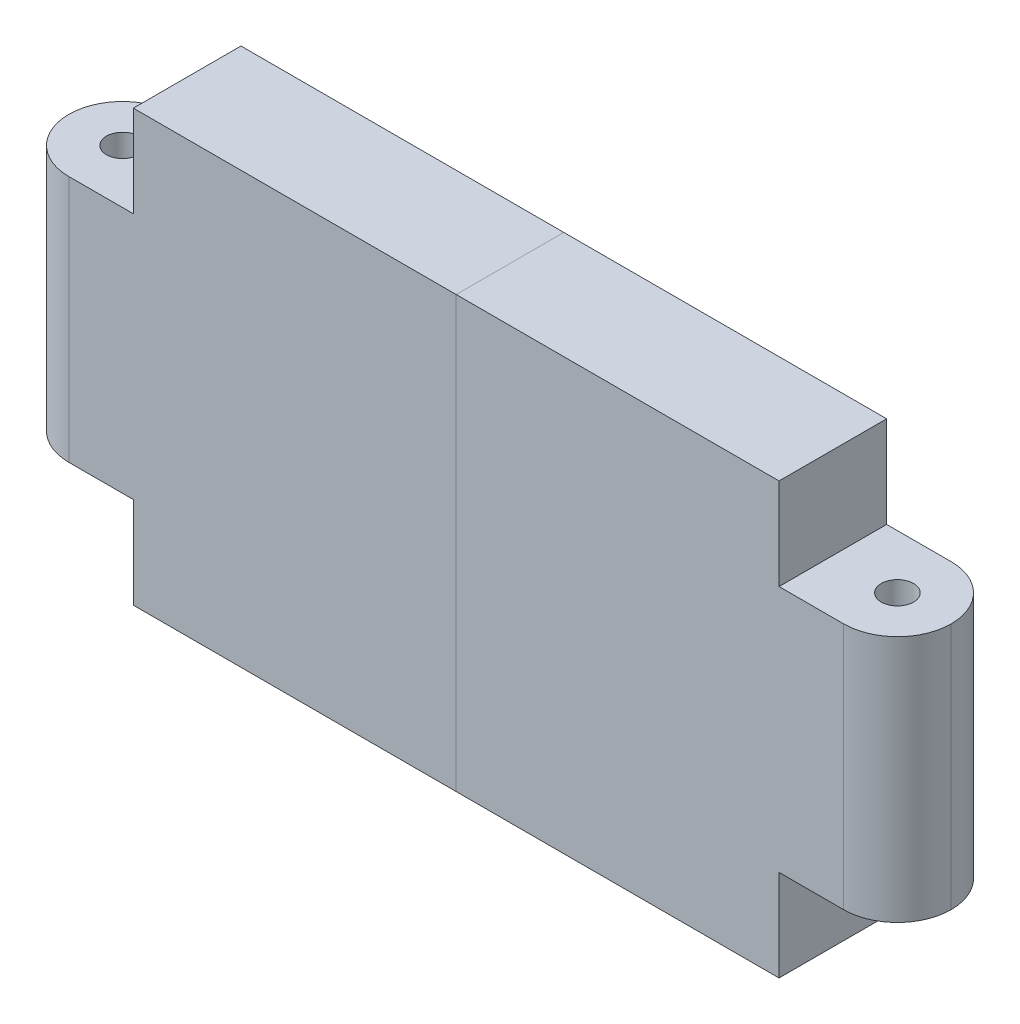
ISO-10303-21;
HEADER;
FILE_DESCRIPTION(('STEP AP214'),'2;1');
FILE_NAME('part.step','',(''),(''),'','','');
FILE_SCHEMA(('AUTOMOTIVE_DESIGN { 1 0 10303 214 1 1 1 1 }'));
ENDSEC;
DATA;
#1=APPLICATION_CONTEXT('core data for automotive mechanical design processes');
#2=APPLICATION_PROTOCOL_DEFINITION('international standard','automotive_design',2000,#1);
#3=PRODUCT_CONTEXT('',#1,'mechanical');
#4=PRODUCT('Part','Part','',(#3));
#5=PRODUCT_RELATED_PRODUCT_CATEGORY('part','',(#4));
#6=PRODUCT_DEFINITION_FORMATION('','',#4);
#7=PRODUCT_DEFINITION_CONTEXT('part definition',#1,'design');
#8=PRODUCT_DEFINITION('design','',#6,#7);
#9=PRODUCT_DEFINITION_SHAPE('','',#8);
#10=(LENGTH_UNIT() NAMED_UNIT(*) SI_UNIT(.MILLI.,.METRE.));
#11=(NAMED_UNIT(*) PLANE_ANGLE_UNIT() SI_UNIT($,.RADIAN.));
#12=(NAMED_UNIT(*) SI_UNIT($,.STERADIAN.) SOLID_ANGLE_UNIT());
#13=UNCERTAINTY_MEASURE_WITH_UNIT(LENGTH_MEASURE(1.E-05),#10,'distance_accuracy_value','');
#14=(GEOMETRIC_REPRESENTATION_CONTEXT(3) GLOBAL_UNCERTAINTY_ASSIGNED_CONTEXT((#13)) GLOBAL_UNIT_ASSIGNED_CONTEXT((#10,
#11,#12)) REPRESENTATION_CONTEXT('',''));
#15=CARTESIAN_POINT('',(0.,0.,0.));
#16=DIRECTION('',(0.,0.,1.));
#17=DIRECTION('',(1.,0.,0.));
#18=AXIS2_PLACEMENT_3D('',#15,#16,#17);
#19=CARTESIAN_POINT('',(0.,0.,0.));
#20=DIRECTION('',(-1.,0.,0.));
#21=DIRECTION('',(0.,-1.,0.));
#22=AXIS2_PLACEMENT_3D('',#19,#20,#21);
#23=PLANE('',#22);
#24=DIRECTION('',(0.,-1.,0.));
#25=VECTOR('',#24,1.);
#26=CARTESIAN_POINT('',(0.,0.,10.));
#27=LINE('',#26,#25);
#28=CARTESIAN_POINT('',(0.,20.,10.));
#29=VERTEX_POINT('',#28);
#30=CARTESIAN_POINT('',(0.,-20.,10.));
#31=VERTEX_POINT('',#30);
#32=EDGE_CURVE('E174',#29,#31,#27,.T.);
#33=ORIENTED_EDGE('',*,*,#32,.F.);
#34=DIRECTION('',(0.,0.,-1.));
#35=VECTOR('',#34,1.);
#36=CARTESIAN_POINT('',(0.,20.,10.));
#37=LINE('',#36,#35);
#38=CARTESIAN_POINT('',(0.,20.,0.));
#39=VERTEX_POINT('',#38);
#40=EDGE_CURVE('E140',#29,#39,#37,.T.);
#41=ORIENTED_EDGE('',*,*,#40,.T.);
#42=DIRECTION('',(0.,-1.,0.));
#43=VECTOR('',#42,1.);
#44=CARTESIAN_POINT('',(0.,0.,0.));
#45=LINE('',#44,#43);
#46=CARTESIAN_POINT('',(0.,-20.,0.));
#47=VERTEX_POINT('',#46);
#48=EDGE_CURVE('E127',#39,#47,#45,.T.);
#49=ORIENTED_EDGE('',*,*,#48,.T.);
#50=DIRECTION('',(0.,0.,1.));
#51=VECTOR('',#50,1.);
#52=CARTESIAN_POINT('',(0.,-20.,10.));
#53=LINE('',#52,#51);
#54=EDGE_CURVE('E136',#47,#31,#53,.T.);
#55=ORIENTED_EDGE('',*,*,#54,.T.);
#56=EDGE_LOOP('',(#33,#41,#49,#55));
#57=FACE_BOUND('',#56,.T.);
#58=ADVANCED_FACE('F48',(#57),#23,.T.);
#59=CARTESIAN_POINT('',(-30.,20.,10.));
#60=DIRECTION('',(0.,-1.,0.));
#61=DIRECTION('',(0.,0.,-1.));
#62=AXIS2_PLACEMENT_3D('',#59,#60,#61);
#63=PLANE('',#62);
#64=ORIENTED_EDGE('',*,*,#40,.F.);
#65=DIRECTION('',(-1.,0.,0.));
#66=VECTOR('',#65,1.);
#67=CARTESIAN_POINT('',(-30.,20.,10.));
#68=LINE('',#67,#66);
#69=CARTESIAN_POINT('',(30.,20.,10.));
#70=VERTEX_POINT('',#69);
#71=EDGE_CURVE('E148',#70,#29,#68,.T.);
#72=ORIENTED_EDGE('',*,*,#71,.F.);
#73=DIRECTION('',(0.,0.,-1.));
#74=VECTOR('',#73,1.);
#75=CARTESIAN_POINT('',(30.,20.,10.));
#76=LINE('',#75,#74);
#77=CARTESIAN_POINT('',(30.,20.,0.));
#78=VERTEX_POINT('',#77);
#79=EDGE_CURVE('E190',#70,#78,#76,.T.);
#80=ORIENTED_EDGE('',*,*,#79,.T.);
#81=DIRECTION('',(-1.,0.,0.));
#82=VECTOR('',#81,1.);
#83=CARTESIAN_POINT('',(-30.,20.,0.));
#84=LINE('',#83,#82);
#85=EDGE_CURVE('E52',#78,#39,#84,.T.);
#86=ORIENTED_EDGE('',*,*,#85,.T.);
#87=EDGE_LOOP('',(#64,#72,#80,#86));
#88=FACE_BOUND('',#87,.T.);
#89=ADVANCED_FACE('F214',(#88),#63,.F.);
#90=CARTESIAN_POINT('',(-30.,-20.,10.));
#91=DIRECTION('',(0.,1.,0.));
#92=DIRECTION('',(0.,0.,1.));
#93=AXIS2_PLACEMENT_3D('',#90,#91,#92);
#94=PLANE('',#93);
#95=ORIENTED_EDGE('',*,*,#54,.F.);
#96=DIRECTION('',(1.,0.,0.));
#97=VECTOR('',#96,1.);
#98=CARTESIAN_POINT('',(-30.,-20.,0.));
#99=LINE('',#98,#97);
#100=CARTESIAN_POINT('',(30.,-20.,0.));
#101=VERTEX_POINT('',#100);
#102=EDGE_CURVE('E122',#47,#101,#99,.T.);
#103=ORIENTED_EDGE('',*,*,#102,.T.);
#104=DIRECTION('',(0.,0.,-1.));
#105=VECTOR('',#104,1.);
#106=CARTESIAN_POINT('',(30.,-20.,10.));
#107=LINE('',#106,#105);
#108=CARTESIAN_POINT('',(30.,-20.,10.));
#109=VERTEX_POINT('',#108);
#110=EDGE_CURVE('E149',#109,#101,#107,.T.);
#111=ORIENTED_EDGE('',*,*,#110,.F.);
#112=DIRECTION('',(1.,0.,0.));
#113=VECTOR('',#112,1.);
#114=CARTESIAN_POINT('',(-30.,-20.,10.));
#115=LINE('',#114,#113);
#116=EDGE_CURVE('E138',#31,#109,#115,.T.);
#117=ORIENTED_EDGE('',*,*,#116,.F.);
#118=EDGE_LOOP('',(#95,#103,#111,#117));
#119=FACE_BOUND('',#118,.T.);
#120=ADVANCED_FACE('F137',(#119),#94,.F.);
#121=CARTESIAN_POINT('',(0.,0.,10.));
#122=DIRECTION('',(0.,0.,1.));
#123=DIRECTION('',(1.,0.,0.));
#124=AXIS2_PLACEMENT_3D('',#121,#122,#123);
#125=PLANE('',#124);
#126=ORIENTED_EDGE('',*,*,#71,.T.);
#127=ORIENTED_EDGE('',*,*,#32,.T.);
#128=ORIENTED_EDGE('',*,*,#116,.T.);
#129=DIRECTION('',(0.,1.,0.));
#130=VECTOR('',#129,1.);
#131=CARTESIAN_POINT('',(30.,20.,10.));
#132=LINE('',#131,#130);
#133=CARTESIAN_POINT('',(30.,-11.5,10.));
#134=VERTEX_POINT('',#133);
#135=EDGE_CURVE('E151',#109,#134,#132,.T.);
#136=ORIENTED_EDGE('',*,*,#135,.T.);
#137=DIRECTION('',(-1.,0.,0.));
#138=VECTOR('',#137,1.);
#139=CARTESIAN_POINT('',(41.,-11.5,10.));
#140=LINE('',#139,#138);
#141=CARTESIAN_POINT('',(36.,-11.5,10.));
#142=VERTEX_POINT('',#141);
#143=EDGE_CURVE('E73',#142,#134,#140,.T.);
#144=ORIENTED_EDGE('',*,*,#143,.F.);
#145=DIRECTION('',(0.,1.,0.));
#146=VECTOR('',#145,1.);
#147=CARTESIAN_POINT('',(36.,0.,10.));
#148=LINE('',#147,#146);
#149=CARTESIAN_POINT('',(36.,11.5,10.));
#150=VERTEX_POINT('',#149);
#151=EDGE_CURVE('E175',#142,#150,#148,.T.);
#152=ORIENTED_EDGE('',*,*,#151,.T.);
#153=DIRECTION('',(-1.,0.,0.));
#154=VECTOR('',#153,1.);
#155=CARTESIAN_POINT('',(41.,11.5,10.));
#156=LINE('',#155,#154);
#157=CARTESIAN_POINT('',(30.,11.5,10.));
#158=VERTEX_POINT('',#157);
#159=EDGE_CURVE('E65',#150,#158,#156,.T.);
#160=ORIENTED_EDGE('',*,*,#159,.T.);
#161=EDGE_CURVE('E133',#158,#70,#132,.T.);
#162=ORIENTED_EDGE('',*,*,#161,.T.);
#163=EDGE_LOOP('',(#126,#127,#128,#136,#144,#152,#160,#162));
#164=FACE_BOUND('',#163,.T.);
#165=ADVANCED_FACE('F50',(#164),#125,.T.);
#166=CARTESIAN_POINT('',(0.,0.,0.));
#167=DIRECTION('',(0.,0.,1.));
#168=DIRECTION('',(1.,0.,0.));
#169=AXIS2_PLACEMENT_3D('',#166,#167,#168);
#170=PLANE('',#169);
#171=ORIENTED_EDGE('',*,*,#48,.F.);
#172=ORIENTED_EDGE('',*,*,#85,.F.);
#173=DIRECTION('',(0.,1.,0.));
#174=VECTOR('',#173,1.);
#175=CARTESIAN_POINT('',(30.,20.,0.));
#176=LINE('',#175,#174);
#177=CARTESIAN_POINT('',(30.,11.5,0.));
#178=VERTEX_POINT('',#177);
#179=EDGE_CURVE('E161',#178,#78,#176,.T.);
#180=ORIENTED_EDGE('',*,*,#179,.F.);
#181=DIRECTION('',(-1.,0.,0.));
#182=VECTOR('',#181,1.);
#183=CARTESIAN_POINT('',(41.,11.5,0.));
#184=LINE('',#183,#182);
#185=CARTESIAN_POINT('',(36.,11.5,0.));
#186=VERTEX_POINT('',#185);
#187=EDGE_CURVE('E159',#186,#178,#184,.T.);
#188=ORIENTED_EDGE('',*,*,#187,.F.);
#189=DIRECTION('',(0.,-1.,0.));
#190=VECTOR('',#189,1.);
#191=CARTESIAN_POINT('',(36.,-11.5,0.));
#192=LINE('',#191,#190);
#193=CARTESIAN_POINT('',(36.,-11.5,0.));
#194=VERTEX_POINT('',#193);
#195=EDGE_CURVE('E187',#186,#194,#192,.T.);
#196=ORIENTED_EDGE('',*,*,#195,.T.);
#197=DIRECTION('',(-1.,0.,0.));
#198=VECTOR('',#197,1.);
#199=CARTESIAN_POINT('',(41.,-11.5,0.));
#200=LINE('',#199,#198);
#201=CARTESIAN_POINT('',(30.,-11.5,0.));
#202=VERTEX_POINT('',#201);
#203=EDGE_CURVE('E164',#194,#202,#200,.T.);
#204=ORIENTED_EDGE('',*,*,#203,.T.);
#205=EDGE_CURVE('E129',#101,#202,#176,.T.);
#206=ORIENTED_EDGE('',*,*,#205,.F.);
#207=ORIENTED_EDGE('',*,*,#102,.F.);
#208=EDGE_LOOP('',(#171,#172,#180,#188,#196,#204,#206,#207));
#209=FACE_BOUND('',#208,.T.);
#210=ADVANCED_FACE('F124',(#209),#170,.F.);
#211=CARTESIAN_POINT('',(30.,20.,10.));
#212=DIRECTION('',(-1.,0.,0.));
#213=DIRECTION('',(0.,-1.,0.));
#214=AXIS2_PLACEMENT_3D('',#211,#212,#213);
#215=PLANE('',#214);
#216=ORIENTED_EDGE('',*,*,#205,.T.);
#217=DIRECTION('',(0.,0.,1.));
#218=VECTOR('',#217,1.);
#219=CARTESIAN_POINT('',(30.,-11.5,0.));
#220=LINE('',#219,#218);
#221=EDGE_CURVE('E166',#202,#134,#220,.T.);
#222=ORIENTED_EDGE('',*,*,#221,.T.);
#223=ORIENTED_EDGE('',*,*,#135,.F.);
#224=ORIENTED_EDGE('',*,*,#110,.T.);
#225=EDGE_LOOP('',(#216,#222,#223,#224));
#226=FACE_BOUND('',#225,.T.);
#227=ADVANCED_FACE('F195',(#226),#215,.F.);
#228=ORIENTED_EDGE('',*,*,#161,.F.);
#229=DIRECTION('',(0.,0.,-1.));
#230=VECTOR('',#229,1.);
#231=CARTESIAN_POINT('',(30.,11.5,0.));
#232=LINE('',#231,#230);
#233=EDGE_CURVE('E168',#158,#178,#232,.T.);
#234=ORIENTED_EDGE('',*,*,#233,.T.);
#235=ORIENTED_EDGE('',*,*,#179,.T.);
#236=ORIENTED_EDGE('',*,*,#79,.F.);
#237=EDGE_LOOP('',(#228,#234,#235,#236));
#238=FACE_BOUND('',#237,.T.);
#239=ADVANCED_FACE('F234',(#238),#215,.F.);
#240=CARTESIAN_POINT('',(41.,11.5,0.));
#241=DIRECTION('',(0.,1.,0.));
#242=DIRECTION('',(-1.,0.,0.));
#243=AXIS2_PLACEMENT_3D('',#240,#241,#242);
#244=PLANE('',#243);
#245=CARTESIAN_POINT('',(36.,11.5,5.));
#246=DIRECTION('',(0.,-1.,0.));
#247=DIRECTION('',(1.,0.,0.));
#248=AXIS2_PLACEMENT_3D('',#245,#246,#247);
#249=CIRCLE('',#248,1.5);
#250=CARTESIAN_POINT('',(37.5,11.5,5.));
#251=VERTEX_POINT('',#250);
#252=EDGE_CURVE('E57',#251,#251,#249,.T.);
#253=ORIENTED_EDGE('',*,*,#252,.T.);
#254=EDGE_LOOP('',(#253));
#255=FACE_BOUND('',#254,.T.);
#256=CARTESIAN_POINT('',(36.,11.5,5.));
#257=DIRECTION('',(0.,1.,0.));
#258=DIRECTION('',(-1.,0.,0.));
#259=AXIS2_PLACEMENT_3D('',#256,#257,#258);
#260=CIRCLE('',#259,5.);
#261=CARTESIAN_POINT('',(41.,11.5,5.));
#262=VERTEX_POINT('',#261);
#263=EDGE_CURVE('E179',#150,#262,#260,.T.);
#264=ORIENTED_EDGE('',*,*,#263,.T.);
#265=CARTESIAN_POINT('',(36.,11.5,5.));
#266=DIRECTION('',(0.,1.,0.));
#267=DIRECTION('',(-1.,0.,0.));
#268=AXIS2_PLACEMENT_3D('',#265,#266,#267);
#269=CIRCLE('',#268,5.);
#270=EDGE_CURVE('E176',#262,#186,#269,.T.);
#271=ORIENTED_EDGE('',*,*,#270,.T.);
#272=ORIENTED_EDGE('',*,*,#187,.T.);
#273=ORIENTED_EDGE('',*,*,#233,.F.);
#274=ORIENTED_EDGE('',*,*,#159,.F.);
#275=EDGE_LOOP('',(#264,#271,#272,#273,#274));
#276=FACE_BOUND('',#275,.T.);
#277=ADVANCED_FACE('F230',(#255,#276),#244,.T.);
#278=CARTESIAN_POINT('',(41.,-11.5,0.));
#279=DIRECTION('',(0.,-1.,0.));
#280=DIRECTION('',(1.,0.,0.));
#281=AXIS2_PLACEMENT_3D('',#278,#279,#280);
#282=PLANE('',#281);
#283=CARTESIAN_POINT('',(36.,-11.5,5.));
#284=DIRECTION('',(0.,-1.,0.));
#285=DIRECTION('',(1.,0.,0.));
#286=AXIS2_PLACEMENT_3D('',#283,#284,#285);
#287=CIRCLE('',#286,1.5);
#288=CARTESIAN_POINT('',(37.5,-11.5,5.));
#289=VERTEX_POINT('',#288);
#290=EDGE_CURVE('E171',#289,#289,#287,.F.);
#291=ORIENTED_EDGE('',*,*,#290,.T.);
#292=EDGE_LOOP('',(#291));
#293=FACE_BOUND('',#292,.T.);
#294=ORIENTED_EDGE('',*,*,#203,.F.);
#295=CARTESIAN_POINT('',(36.,-11.5,5.));
#296=DIRECTION('',(0.,-1.,0.));
#297=DIRECTION('',(1.,0.,0.));
#298=AXIS2_PLACEMENT_3D('',#295,#296,#297);
#299=CIRCLE('',#298,5.);
#300=CARTESIAN_POINT('',(41.,-11.5,5.));
#301=VERTEX_POINT('',#300);
#302=EDGE_CURVE('E183',#194,#301,#299,.T.);
#303=ORIENTED_EDGE('',*,*,#302,.T.);
#304=CARTESIAN_POINT('',(36.,-11.5,5.));
#305=DIRECTION('',(0.,-1.,0.));
#306=DIRECTION('',(1.,0.,0.));
#307=AXIS2_PLACEMENT_3D('',#304,#305,#306);
#308=CIRCLE('',#307,5.);
#309=EDGE_CURVE('E185',#301,#142,#308,.T.);
#310=ORIENTED_EDGE('',*,*,#309,.T.);
#311=ORIENTED_EDGE('',*,*,#143,.T.);
#312=ORIENTED_EDGE('',*,*,#221,.F.);
#313=EDGE_LOOP('',(#294,#303,#310,#311,#312));
#314=FACE_BOUND('',#313,.T.);
#315=ADVANCED_FACE('F197',(#293,#314),#282,.T.);
#316=CARTESIAN_POINT('',(36.,-18.5,5.));
#317=DIRECTION('',(0.,1.,0.));
#318=DIRECTION('',(-1.,0.,0.));
#319=AXIS2_PLACEMENT_3D('',#316,#317,#318);
#320=CYLINDRICAL_SURFACE('',#319,1.5);
#321=ORIENTED_EDGE('',*,*,#290,.F.);
#322=EDGE_LOOP('',(#321));
#323=FACE_BOUND('',#322,.T.);
#324=ORIENTED_EDGE('',*,*,#252,.F.);
#325=EDGE_LOOP('',(#324));
#326=FACE_BOUND('',#325,.T.);
#327=ADVANCED_FACE('F224',(#323,#326),#320,.F.);
#328=CARTESIAN_POINT('',(36.,0.,5.));
#329=DIRECTION('',(0.,1.,0.));
#330=DIRECTION('',(-1.,0.,0.));
#331=AXIS2_PLACEMENT_3D('',#328,#329,#330);
#332=CYLINDRICAL_SURFACE('',#331,5.);
#333=DIRECTION('',(0.,1.,0.));
#334=VECTOR('',#333,1.);
#335=CARTESIAN_POINT('',(41.,0.,5.));
#336=LINE('',#335,#334);
#337=EDGE_CURVE('E12',#262,#301,#336,.F.);
#338=ORIENTED_EDGE('',*,*,#337,.F.);
#339=ORIENTED_EDGE('',*,*,#263,.F.);
#340=ORIENTED_EDGE('',*,*,#151,.F.);
#341=ORIENTED_EDGE('',*,*,#309,.F.);
#342=EDGE_LOOP('',(#338,#339,#340,#341));
#343=FACE_BOUND('',#342,.T.);
#344=ADVANCED_FACE('F208',(#343),#332,.T.);
#345=CARTESIAN_POINT('',(36.,0.,5.));
#346=DIRECTION('',(0.,1.,0.));
#347=DIRECTION('',(-1.,0.,0.));
#348=AXIS2_PLACEMENT_3D('',#345,#346,#347);
#349=CYLINDRICAL_SURFACE('',#348,5.);
#350=ORIENTED_EDGE('',*,*,#270,.F.);
#351=ORIENTED_EDGE('',*,*,#337,.T.);
#352=ORIENTED_EDGE('',*,*,#302,.F.);
#353=ORIENTED_EDGE('',*,*,#195,.F.);
#354=EDGE_LOOP('',(#350,#351,#352,#353));
#355=FACE_BOUND('',#354,.T.);
#356=ADVANCED_FACE('F204',(#355),#349,.T.);
#357=CLOSED_SHELL('',(#58,#89,#120,#165,#210,#227,#239,#277,#315,#327,#344,#356));
#358=MANIFOLD_SOLID_BREP('B2',#357);
#359=CARTESIAN_POINT('',(0.,0.,0.));
#360=DIRECTION('',(-1.,0.,0.));
#361=DIRECTION('',(0.,-1.,0.));
#362=AXIS2_PLACEMENT_3D('',#359,#360,#361);
#363=PLANE('',#362);
#364=DIRECTION('',(0.,-1.,0.));
#365=VECTOR('',#364,1.);
#366=CARTESIAN_POINT('',(0.,0.,10.));
#367=LINE('',#366,#365);
#368=CARTESIAN_POINT('',(0.,20.,10.));
#369=VERTEX_POINT('',#368);
#370=CARTESIAN_POINT('',(0.,-20.,10.));
#371=VERTEX_POINT('',#370);
#372=EDGE_CURVE('E46',#369,#371,#367,.T.);
#373=ORIENTED_EDGE('',*,*,#372,.T.);
#374=DIRECTION('',(0.,0.,1.));
#375=VECTOR('',#374,1.);
#376=CARTESIAN_POINT('',(0.,-20.,10.));
#377=LINE('',#376,#375);
#378=CARTESIAN_POINT('',(0.,-20.,0.));
#379=VERTEX_POINT('',#378);
#380=EDGE_CURVE('E373',#379,#371,#377,.T.);
#381=ORIENTED_EDGE('',*,*,#380,.F.);
#382=DIRECTION('',(0.,-1.,0.));
#383=VECTOR('',#382,1.);
#384=CARTESIAN_POINT('',(0.,0.,0.));
#385=LINE('',#384,#383);
#386=CARTESIAN_POINT('',(0.,20.,0.));
#387=VERTEX_POINT('',#386);
#388=EDGE_CURVE('E491',#387,#379,#385,.T.);
#389=ORIENTED_EDGE('',*,*,#388,.F.);
#390=DIRECTION('',(0.,0.,-1.));
#391=VECTOR('',#390,1.);
#392=CARTESIAN_POINT('',(0.,20.,10.));
#393=LINE('',#392,#391);
#394=EDGE_CURVE('E360',#369,#387,#393,.T.);
#395=ORIENTED_EDGE('',*,*,#394,.F.);
#396=EDGE_LOOP('',(#373,#381,#389,#395));
#397=FACE_BOUND('',#396,.T.);
#398=ADVANCED_FACE('F353',(#397),#363,.F.);
#399=CARTESIAN_POINT('',(-36.,-18.5,5.));
#400=DIRECTION('',(0.,1.,0.));
#401=DIRECTION('',(-1.,0.,0.));
#402=AXIS2_PLACEMENT_3D('',#399,#400,#401);
#403=CYLINDRICAL_SURFACE('',#402,1.5);
#404=CARTESIAN_POINT('',(-36.,11.5,5.));
#405=DIRECTION('',(0.,1.,0.));
#406=DIRECTION('',(-1.,0.,0.));
#407=AXIS2_PLACEMENT_3D('',#404,#405,#406);
#408=CIRCLE('',#407,1.5);
#409=CARTESIAN_POINT('',(-37.5,11.5,5.));
#410=VERTEX_POINT('',#409);
#411=EDGE_CURVE('E456',#410,#410,#408,.T.);
#412=ORIENTED_EDGE('',*,*,#411,.T.);
#413=EDGE_LOOP('',(#412));
#414=FACE_BOUND('',#413,.T.);
#415=CARTESIAN_POINT('',(-36.,-11.5,5.));
#416=DIRECTION('',(0.,1.,0.));
#417=DIRECTION('',(-1.,0.,0.));
#418=AXIS2_PLACEMENT_3D('',#415,#416,#417);
#419=CIRCLE('',#418,1.5);
#420=CARTESIAN_POINT('',(-37.5,-11.5,5.));
#421=VERTEX_POINT('',#420);
#422=EDGE_CURVE('E450',#421,#421,#419,.T.);
#423=ORIENTED_EDGE('',*,*,#422,.F.);
#424=EDGE_LOOP('',(#423));
#425=FACE_BOUND('',#424,.T.);
#426=ADVANCED_FACE('F532',(#414,#425),#403,.F.);
#427=CARTESIAN_POINT('',(-36.,0.,5.));
#428=DIRECTION('',(0.,1.,0.));
#429=DIRECTION('',(-1.,0.,0.));
#430=AXIS2_PLACEMENT_3D('',#427,#428,#429);
#431=CYLINDRICAL_SURFACE('',#430,5.);
#432=DIRECTION('',(0.,1.,0.));
#433=VECTOR('',#432,1.);
#434=CARTESIAN_POINT('',(-36.,0.,10.));
#435=LINE('',#434,#433);
#436=CARTESIAN_POINT('',(-36.,11.5,10.));
#437=VERTEX_POINT('',#436);
#438=CARTESIAN_POINT('',(-36.,-11.5,10.));
#439=VERTEX_POINT('',#438);
#440=EDGE_CURVE('E430',#437,#439,#435,.F.);
#441=ORIENTED_EDGE('',*,*,#440,.F.);
#442=CARTESIAN_POINT('',(-36.,11.5,5.));
#443=DIRECTION('',(0.,-1.,0.));
#444=DIRECTION('',(1.,0.,0.));
#445=AXIS2_PLACEMENT_3D('',#442,#443,#444);
#446=CIRCLE('',#445,5.);
#447=CARTESIAN_POINT('',(-41.,11.5,5.));
#448=VERTEX_POINT('',#447);
#449=EDGE_CURVE('E487',#448,#437,#446,.F.);
#450=ORIENTED_EDGE('',*,*,#449,.F.);
#451=DIRECTION('',(0.,1.,0.));
#452=VECTOR('',#451,1.);
#453=CARTESIAN_POINT('',(-41.,0.,5.));
#454=LINE('',#453,#452);
#455=CARTESIAN_POINT('',(-41.,-11.5,5.));
#456=VERTEX_POINT('',#455);
#457=EDGE_CURVE('E492',#456,#448,#454,.T.);
#458=ORIENTED_EDGE('',*,*,#457,.F.);
#459=CARTESIAN_POINT('',(-36.,-11.5,5.));
#460=DIRECTION('',(0.,1.,0.));
#461=DIRECTION('',(-1.,0.,0.));
#462=AXIS2_PLACEMENT_3D('',#459,#460,#461);
#463=CIRCLE('',#462,5.);
#464=EDGE_CURVE('E483',#439,#456,#463,.F.);
#465=ORIENTED_EDGE('',*,*,#464,.F.);
#466=EDGE_LOOP('',(#441,#450,#458,#465));
#467=FACE_BOUND('',#466,.T.);
#468=ADVANCED_FACE('F514',(#467),#431,.T.);
#469=CARTESIAN_POINT('',(-30.,20.,10.));
#470=DIRECTION('',(1.,0.,0.));
#471=DIRECTION('',(0.,1.,0.));
#472=AXIS2_PLACEMENT_3D('',#469,#470,#471);
#473=PLANE('',#472);
#474=DIRECTION('',(0.,0.,-1.));
#475=VECTOR('',#474,1.);
#476=CARTESIAN_POINT('',(-30.,11.5,0.));
#477=LINE('',#476,#475);
#478=CARTESIAN_POINT('',(-30.,11.5,10.));
#479=VERTEX_POINT('',#478);
#480=CARTESIAN_POINT('',(-30.,11.5,0.));
#481=VERTEX_POINT('',#480);
#482=EDGE_CURVE('E449',#479,#481,#477,.T.);
#483=ORIENTED_EDGE('',*,*,#482,.F.);
#484=DIRECTION('',(0.,-1.,0.));
#485=VECTOR('',#484,1.);
#486=CARTESIAN_POINT('',(-30.,20.,10.));
#487=LINE('',#486,#485);
#488=CARTESIAN_POINT('',(-30.,20.,10.));
#489=VERTEX_POINT('',#488);
#490=EDGE_CURVE('E444',#489,#479,#487,.T.);
#491=ORIENTED_EDGE('',*,*,#490,.F.);
#492=DIRECTION('',(0.,0.,-1.));
#493=VECTOR('',#492,1.);
#494=CARTESIAN_POINT('',(-30.,20.,10.));
#495=LINE('',#494,#493);
#496=CARTESIAN_POINT('',(-30.,20.,0.));
#497=VERTEX_POINT('',#496);
#498=EDGE_CURVE('E476',#489,#497,#495,.T.);
#499=ORIENTED_EDGE('',*,*,#498,.T.);
#500=DIRECTION('',(0.,-1.,0.));
#501=VECTOR('',#500,1.);
#502=CARTESIAN_POINT('',(-30.,20.,0.));
#503=LINE('',#502,#501);
#504=EDGE_CURVE('E471',#497,#481,#503,.T.);
#505=ORIENTED_EDGE('',*,*,#504,.T.);
#506=EDGE_LOOP('',(#483,#491,#499,#505));
#507=FACE_BOUND('',#506,.T.);
#508=ADVANCED_FACE('F508',(#507),#473,.F.);
#509=CARTESIAN_POINT('',(-41.,11.5,0.));
#510=DIRECTION('',(0.,-1.,0.));
#511=DIRECTION('',(1.,0.,0.));
#512=AXIS2_PLACEMENT_3D('',#509,#510,#511);
#513=PLANE('',#512);
#514=ORIENTED_EDGE('',*,*,#411,.F.);
#515=EDGE_LOOP('',(#514));
#516=FACE_BOUND('',#515,.T.);
#517=DIRECTION('',(1.,0.,0.));
#518=VECTOR('',#517,1.);
#519=CARTESIAN_POINT('',(-41.,11.5,0.));
#520=LINE('',#519,#518);
#521=CARTESIAN_POINT('',(-36.,11.5,0.));
#522=VERTEX_POINT('',#521);
#523=EDGE_CURVE('E453',#522,#481,#520,.T.);
#524=ORIENTED_EDGE('',*,*,#523,.F.);
#525=CARTESIAN_POINT('',(-36.,11.5,5.));
#526=DIRECTION('',(0.,-1.,0.));
#527=DIRECTION('',(1.,0.,0.));
#528=AXIS2_PLACEMENT_3D('',#525,#526,#527);
#529=CIRCLE('',#528,5.);
#530=EDGE_CURVE('E489',#522,#448,#529,.F.);
#531=ORIENTED_EDGE('',*,*,#530,.T.);
#532=ORIENTED_EDGE('',*,*,#449,.T.);
#533=DIRECTION('',(1.,0.,0.));
#534=VECTOR('',#533,1.);
#535=CARTESIAN_POINT('',(-41.,11.5,10.));
#536=LINE('',#535,#534);
#537=EDGE_CURVE('E435',#437,#479,#536,.T.);
#538=ORIENTED_EDGE('',*,*,#537,.T.);
#539=ORIENTED_EDGE('',*,*,#482,.T.);
#540=EDGE_LOOP('',(#524,#531,#532,#538,#539));
#541=FACE_BOUND('',#540,.T.);
#542=ADVANCED_FACE('F511',(#516,#541),#513,.F.);
#543=CARTESIAN_POINT('',(-36.,0.,5.));
#544=DIRECTION('',(0.,1.,0.));
#545=DIRECTION('',(-1.,0.,0.));
#546=AXIS2_PLACEMENT_3D('',#543,#544,#545);
#547=CYLINDRICAL_SURFACE('',#546,5.);
#548=ORIENTED_EDGE('',*,*,#530,.F.);
#549=DIRECTION('',(0.,-1.,0.));
#550=VECTOR('',#549,1.);
#551=CARTESIAN_POINT('',(-36.,11.5,0.));
#552=LINE('',#551,#550);
#553=CARTESIAN_POINT('',(-36.,-11.5,0.));
#554=VERTEX_POINT('',#553);
#555=EDGE_CURVE('E479',#554,#522,#552,.F.);
#556=ORIENTED_EDGE('',*,*,#555,.F.);
#557=CARTESIAN_POINT('',(-36.,-11.5,5.));
#558=DIRECTION('',(0.,1.,0.));
#559=DIRECTION('',(-1.,0.,0.));
#560=AXIS2_PLACEMENT_3D('',#557,#558,#559);
#561=CIRCLE('',#560,5.);
#562=EDGE_CURVE('E485',#456,#554,#561,.F.);
#563=ORIENTED_EDGE('',*,*,#562,.F.);
#564=ORIENTED_EDGE('',*,*,#457,.T.);
#565=EDGE_LOOP('',(#548,#556,#563,#564));
#566=FACE_BOUND('',#565,.T.);
#567=ADVANCED_FACE('F519',(#566),#547,.T.);
#568=CARTESIAN_POINT('',(-41.,-11.5,0.));
#569=DIRECTION('',(0.,1.,0.));
#570=DIRECTION('',(-1.,0.,0.));
#571=AXIS2_PLACEMENT_3D('',#568,#569,#570);
#572=PLANE('',#571);
#573=ORIENTED_EDGE('',*,*,#422,.T.);
#574=EDGE_LOOP('',(#573));
#575=FACE_BOUND('',#574,.T.);
#576=ORIENTED_EDGE('',*,*,#464,.T.);
#577=ORIENTED_EDGE('',*,*,#562,.T.);
#578=DIRECTION('',(1.,0.,0.));
#579=VECTOR('',#578,1.);
#580=CARTESIAN_POINT('',(-41.,-11.5,0.));
#581=LINE('',#580,#579);
#582=CARTESIAN_POINT('',(-30.,-11.5,0.));
#583=VERTEX_POINT('',#582);
#584=EDGE_CURVE('E434',#554,#583,#581,.T.);
#585=ORIENTED_EDGE('',*,*,#584,.T.);
#586=DIRECTION('',(0.,0.,1.));
#587=VECTOR('',#586,1.);
#588=CARTESIAN_POINT('',(-30.,-11.5,0.));
#589=LINE('',#588,#587);
#590=CARTESIAN_POINT('',(-30.,-11.5,10.));
#591=VERTEX_POINT('',#590);
#592=EDGE_CURVE('E440',#583,#591,#589,.T.);
#593=ORIENTED_EDGE('',*,*,#592,.T.);
#594=DIRECTION('',(1.,0.,0.));
#595=VECTOR('',#594,1.);
#596=CARTESIAN_POINT('',(-41.,-11.5,10.));
#597=LINE('',#596,#595);
#598=EDGE_CURVE('E422',#439,#591,#597,.T.);
#599=ORIENTED_EDGE('',*,*,#598,.F.);
#600=EDGE_LOOP('',(#576,#577,#585,#593,#599));
#601=FACE_BOUND('',#600,.T.);
#602=ADVANCED_FACE('F447',(#575,#601),#572,.F.);
#603=ORIENTED_EDGE('',*,*,#592,.F.);
#604=CARTESIAN_POINT('',(-30.,-20.,0.));
#605=VERTEX_POINT('',#604);
#606=EDGE_CURVE('E470',#583,#605,#503,.T.);
#607=ORIENTED_EDGE('',*,*,#606,.T.);
#608=DIRECTION('',(0.,0.,-1.));
#609=VECTOR('',#608,1.);
#610=CARTESIAN_POINT('',(-30.,-20.,10.));
#611=LINE('',#610,#609);
#612=CARTESIAN_POINT('',(-30.,-20.,10.));
#613=VERTEX_POINT('',#612);
#614=EDGE_CURVE('E443',#613,#605,#611,.T.);
#615=ORIENTED_EDGE('',*,*,#614,.F.);
#616=EDGE_CURVE('E426',#591,#613,#487,.T.);
#617=ORIENTED_EDGE('',*,*,#616,.F.);
#618=EDGE_LOOP('',(#603,#607,#615,#617));
#619=FACE_BOUND('',#618,.T.);
#620=ADVANCED_FACE('F439',(#619),#473,.F.);
#621=CARTESIAN_POINT('',(-30.,-20.,10.));
#622=DIRECTION('',(0.,1.,0.));
#623=DIRECTION('',(0.,0.,1.));
#624=AXIS2_PLACEMENT_3D('',#621,#622,#623);
#625=PLANE('',#624);
#626=DIRECTION('',(1.,0.,0.));
#627=VECTOR('',#626,1.);
#628=CARTESIAN_POINT('',(-30.,-20.,0.));
#629=LINE('',#628,#627);
#630=EDGE_CURVE('E464',#605,#379,#629,.T.);
#631=ORIENTED_EDGE('',*,*,#630,.T.);
#632=ORIENTED_EDGE('',*,*,#380,.T.);
#633=DIRECTION('',(1.,0.,0.));
#634=VECTOR('',#633,1.);
#635=CARTESIAN_POINT('',(-30.,-20.,10.));
#636=LINE('',#635,#634);
#637=EDGE_CURVE('E467',#613,#371,#636,.T.);
#638=ORIENTED_EDGE('',*,*,#637,.F.);
#639=ORIENTED_EDGE('',*,*,#614,.T.);
#640=EDGE_LOOP('',(#631,#632,#638,#639));
#641=FACE_BOUND('',#640,.T.);
#642=ADVANCED_FACE('F545',(#641),#625,.F.);
#643=CARTESIAN_POINT('',(-30.,20.,10.));
#644=DIRECTION('',(0.,-1.,0.));
#645=DIRECTION('',(0.,0.,-1.));
#646=AXIS2_PLACEMENT_3D('',#643,#644,#645);
#647=PLANE('',#646);
#648=DIRECTION('',(-1.,0.,0.));
#649=VECTOR('',#648,1.);
#650=CARTESIAN_POINT('',(-30.,20.,10.));
#651=LINE('',#650,#649);
#652=EDGE_CURVE('E445',#369,#489,#651,.T.);
#653=ORIENTED_EDGE('',*,*,#652,.F.);
#654=ORIENTED_EDGE('',*,*,#394,.T.);
#655=DIRECTION('',(-1.,0.,0.));
#656=VECTOR('',#655,1.);
#657=CARTESIAN_POINT('',(-30.,20.,0.));
#658=LINE('',#657,#656);
#659=EDGE_CURVE('E463',#387,#497,#658,.T.);
#660=ORIENTED_EDGE('',*,*,#659,.T.);
#661=ORIENTED_EDGE('',*,*,#498,.F.);
#662=EDGE_LOOP('',(#653,#654,#660,#661));
#663=FACE_BOUND('',#662,.T.);
#664=ADVANCED_FACE('F498',(#663),#647,.F.);
#665=CARTESIAN_POINT('',(0.,0.,0.));
#666=DIRECTION('',(0.,0.,1.));
#667=DIRECTION('',(1.,0.,0.));
#668=AXIS2_PLACEMENT_3D('',#665,#666,#667);
#669=PLANE('',#668);
#670=ORIENTED_EDGE('',*,*,#659,.F.);
#671=ORIENTED_EDGE('',*,*,#388,.T.);
#672=ORIENTED_EDGE('',*,*,#630,.F.);
#673=ORIENTED_EDGE('',*,*,#606,.F.);
#674=ORIENTED_EDGE('',*,*,#584,.F.);
#675=ORIENTED_EDGE('',*,*,#555,.T.);
#676=ORIENTED_EDGE('',*,*,#523,.T.);
#677=ORIENTED_EDGE('',*,*,#504,.F.);
#678=EDGE_LOOP('',(#670,#671,#672,#673,#674,#675,#676,#677));
#679=FACE_BOUND('',#678,.T.);
#680=ADVANCED_FACE('F504',(#679),#669,.F.);
#681=CARTESIAN_POINT('',(0.,0.,10.));
#682=DIRECTION('',(0.,0.,1.));
#683=DIRECTION('',(1.,0.,0.));
#684=AXIS2_PLACEMENT_3D('',#681,#682,#683);
#685=PLANE('',#684);
#686=ORIENTED_EDGE('',*,*,#372,.F.);
#687=ORIENTED_EDGE('',*,*,#652,.T.);
#688=ORIENTED_EDGE('',*,*,#490,.T.);
#689=ORIENTED_EDGE('',*,*,#537,.F.);
#690=ORIENTED_EDGE('',*,*,#440,.T.);
#691=ORIENTED_EDGE('',*,*,#598,.T.);
#692=ORIENTED_EDGE('',*,*,#616,.T.);
#693=ORIENTED_EDGE('',*,*,#637,.T.);
#694=EDGE_LOOP('',(#686,#687,#688,#689,#690,#691,#692,#693));
#695=FACE_BOUND('',#694,.T.);
#696=ADVANCED_FACE('F424',(#695),#685,.T.);
#697=CLOSED_SHELL('',(#398,#426,#468,#508,#542,#567,#602,#620,#642,#664,#680,#696));
#698=MANIFOLD_SOLID_BREP('B6',#697);
#699=ADVANCED_BREP_SHAPE_REPRESENTATION('',(#18,#358,#698),#14);
#700=SHAPE_DEFINITION_REPRESENTATION(#9,#699);
ENDSEC;
END-ISO-10303-21;
